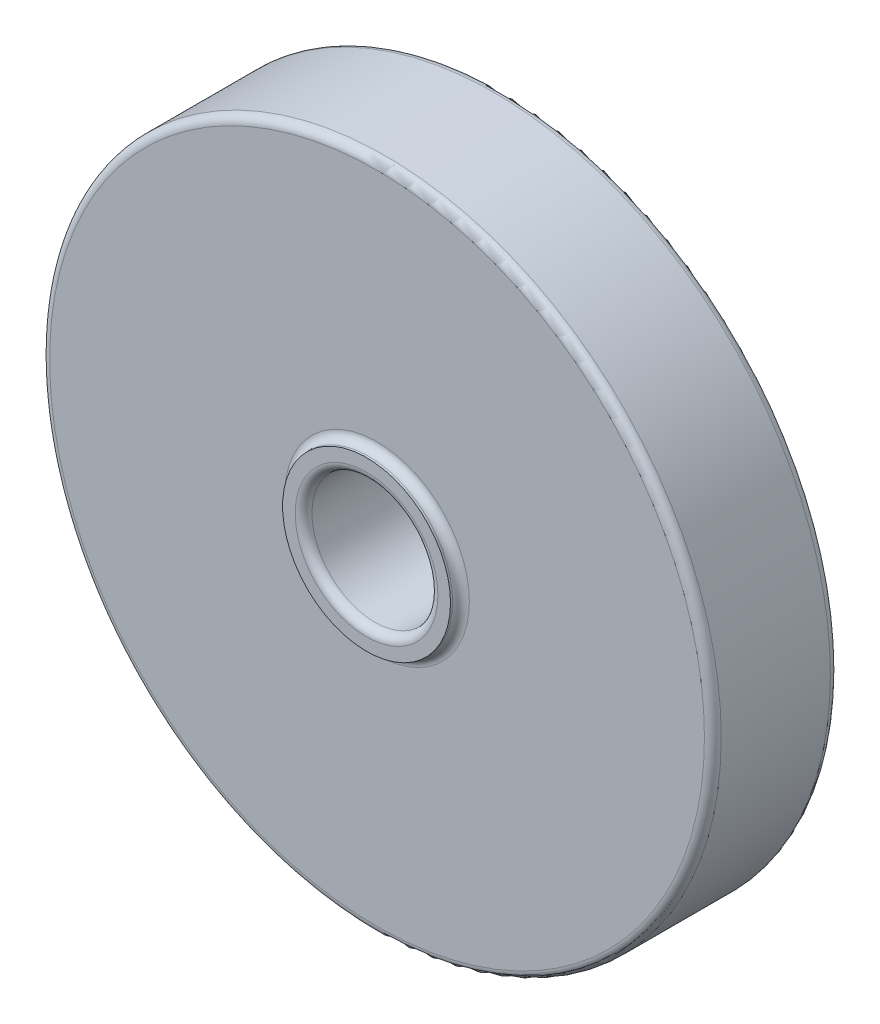
ISO-10303-21;
HEADER;
FILE_DESCRIPTION(('STEP AP214'),'2;1');
FILE_NAME('part.step','',(''),(''),'','','');
FILE_SCHEMA(('AUTOMOTIVE_DESIGN { 1 0 10303 214 1 1 1 1 }'));
ENDSEC;
DATA;
#1=APPLICATION_CONTEXT('core data for automotive mechanical design processes');
#2=APPLICATION_PROTOCOL_DEFINITION('international standard','automotive_design',2000,#1);
#3=PRODUCT_CONTEXT('',#1,'mechanical');
#4=PRODUCT('Part','Part','',(#3));
#5=PRODUCT_RELATED_PRODUCT_CATEGORY('part','',(#4));
#6=PRODUCT_DEFINITION_FORMATION('','',#4);
#7=PRODUCT_DEFINITION_CONTEXT('part definition',#1,'design');
#8=PRODUCT_DEFINITION('design','',#6,#7);
#9=PRODUCT_DEFINITION_SHAPE('','',#8);
#10=(LENGTH_UNIT() NAMED_UNIT(*) SI_UNIT(.MILLI.,.METRE.));
#11=(NAMED_UNIT(*) PLANE_ANGLE_UNIT() SI_UNIT($,.RADIAN.));
#12=(NAMED_UNIT(*) SI_UNIT($,.STERADIAN.) SOLID_ANGLE_UNIT());
#13=UNCERTAINTY_MEASURE_WITH_UNIT(LENGTH_MEASURE(1.E-05),#10,'distance_accuracy_value','');
#14=(GEOMETRIC_REPRESENTATION_CONTEXT(3) GLOBAL_UNCERTAINTY_ASSIGNED_CONTEXT((#13)) GLOBAL_UNIT_ASSIGNED_CONTEXT((#10,
#11,#12)) REPRESENTATION_CONTEXT('',''));
#15=CARTESIAN_POINT('',(0.,0.,0.));
#16=DIRECTION('',(0.,0.,1.));
#17=DIRECTION('',(1.,0.,0.));
#18=AXIS2_PLACEMENT_3D('',#15,#16,#17);
#19=CARTESIAN_POINT('',(0.,0.,3.));
#20=DIRECTION('',(0.,0.,1.));
#21=DIRECTION('',(1.,0.,0.));
#22=AXIS2_PLACEMENT_3D('',#19,#20,#21);
#23=PLANE('',#22);
#24=CARTESIAN_POINT('',(0.,0.,3.));
#25=DIRECTION('',(0.,0.,1.));
#26=DIRECTION('',(1.,0.,0.));
#27=AXIS2_PLACEMENT_3D('',#24,#25,#26);
#28=CIRCLE('',#27,2.2);
#29=CARTESIAN_POINT('',(2.2,0.,3.));
#30=VERTEX_POINT('',#29);
#31=EDGE_CURVE('E10',#30,#30,#28,.F.);
#32=ORIENTED_EDGE('',*,*,#31,.T.);
#33=EDGE_LOOP('',(#32));
#34=FACE_BOUND('',#33,.T.);
#35=CARTESIAN_POINT('',(0.,0.,3.));
#36=DIRECTION('',(0.,0.,1.));
#37=DIRECTION('',(1.,0.,0.));
#38=AXIS2_PLACEMENT_3D('',#35,#36,#37);
#39=CIRCLE('',#38,7.8);
#40=CARTESIAN_POINT('',(7.8,0.,3.));
#41=VERTEX_POINT('',#40);
#42=EDGE_CURVE('E38',#41,#41,#39,.T.);
#43=ORIENTED_EDGE('',*,*,#42,.T.);
#44=EDGE_LOOP('',(#43));
#45=FACE_BOUND('',#44,.T.);
#46=ADVANCED_FACE('F31',(#34,#45),#23,.T.);
#47=CARTESIAN_POINT('',(0.,0.,0.));
#48=DIRECTION('',(0.,0.,1.));
#49=DIRECTION('',(1.,0.,0.));
#50=AXIS2_PLACEMENT_3D('',#47,#48,#49);
#51=PLANE('',#50);
#52=CARTESIAN_POINT('',(0.,0.,0.));
#53=DIRECTION('',(0.,0.,1.));
#54=DIRECTION('',(1.,0.,0.));
#55=AXIS2_PLACEMENT_3D('',#52,#53,#54);
#56=CIRCLE('',#55,7.8);
#57=CARTESIAN_POINT('',(7.8,0.,0.));
#58=VERTEX_POINT('',#57);
#59=EDGE_CURVE('E57',#58,#58,#56,.F.);
#60=ORIENTED_EDGE('',*,*,#59,.T.);
#61=EDGE_LOOP('',(#60));
#62=FACE_BOUND('',#61,.T.);
#63=CARTESIAN_POINT('',(0.,0.,0.));
#64=DIRECTION('',(0.,0.,1.));
#65=DIRECTION('',(1.,0.,0.));
#66=AXIS2_PLACEMENT_3D('',#63,#64,#65);
#67=CIRCLE('',#66,1.7);
#68=CARTESIAN_POINT('',(1.7,0.,0.));
#69=VERTEX_POINT('',#68);
#70=EDGE_CURVE('E60',#69,#69,#67,.T.);
#71=ORIENTED_EDGE('',*,*,#70,.T.);
#72=EDGE_LOOP('',(#71));
#73=FACE_BOUND('',#72,.T.);
#74=ADVANCED_FACE('F92',(#62,#73),#51,.F.);
#75=CARTESIAN_POINT('',(0.,0.,3.));
#76=DIRECTION('',(0.,0.,-1.));
#77=DIRECTION('',(-1.,0.,0.));
#78=AXIS2_PLACEMENT_3D('',#75,#76,#77);
#79=CYLINDRICAL_SURFACE('',#78,8.);
#80=CARTESIAN_POINT('',(0.,0.,0.2));
#81=DIRECTION('',(0.,0.,1.));
#82=DIRECTION('',(1.,0.,0.));
#83=AXIS2_PLACEMENT_3D('',#80,#81,#82);
#84=CIRCLE('',#83,8.);
#85=CARTESIAN_POINT('',(8.,0.,0.2));
#86=VERTEX_POINT('',#85);
#87=EDGE_CURVE('E63',#86,#86,#84,.T.);
#88=ORIENTED_EDGE('',*,*,#87,.T.);
#89=EDGE_LOOP('',(#88));
#90=FACE_BOUND('',#89,.T.);
#91=CARTESIAN_POINT('',(0.,0.,2.8));
#92=DIRECTION('',(0.,0.,1.));
#93=DIRECTION('',(1.,0.,0.));
#94=AXIS2_PLACEMENT_3D('',#91,#92,#93);
#95=CIRCLE('',#94,8.);
#96=CARTESIAN_POINT('',(8.,0.,2.8));
#97=VERTEX_POINT('',#96);
#98=EDGE_CURVE('E66',#97,#97,#95,.F.);
#99=ORIENTED_EDGE('',*,*,#98,.T.);
#100=EDGE_LOOP('',(#99));
#101=FACE_BOUND('',#100,.T.);
#102=ADVANCED_FACE('F33',(#90,#101),#79,.T.);
#103=CARTESIAN_POINT('',(0.,0.,3.));
#104=DIRECTION('',(0.,0.,-1.));
#105=DIRECTION('',(-1.,0.,0.));
#106=AXIS2_PLACEMENT_3D('',#103,#104,#105);
#107=CYLINDRICAL_SURFACE('',#106,1.5);
#108=CARTESIAN_POINT('',(0.,0.,3.05));
#109=DIRECTION('',(0.,0.,1.));
#110=DIRECTION('',(1.,0.,0.));
#111=AXIS2_PLACEMENT_3D('',#108,#109,#110);
#112=CIRCLE('',#111,1.5);
#113=CARTESIAN_POINT('',(1.5,0.,3.05));
#114=VERTEX_POINT('',#113);
#115=EDGE_CURVE('E51',#114,#114,#112,.T.);
#116=ORIENTED_EDGE('',*,*,#115,.T.);
#117=EDGE_LOOP('',(#116));
#118=FACE_BOUND('',#117,.T.);
#119=CARTESIAN_POINT('',(0.,0.,0.2));
#120=DIRECTION('',(0.,0.,1.));
#121=DIRECTION('',(1.,0.,0.));
#122=AXIS2_PLACEMENT_3D('',#119,#120,#121);
#123=CIRCLE('',#122,1.5);
#124=CARTESIAN_POINT('',(1.5,0.,0.2));
#125=VERTEX_POINT('',#124);
#126=EDGE_CURVE('E54',#125,#125,#123,.F.);
#127=ORIENTED_EDGE('',*,*,#126,.T.);
#128=EDGE_LOOP('',(#127));
#129=FACE_BOUND('',#128,.T.);
#130=ADVANCED_FACE('F87',(#118,#129),#107,.F.);
#131=CARTESIAN_POINT('',(0.,0.,3.25));
#132=DIRECTION('',(0.,0.,1.));
#133=DIRECTION('',(1.,0.,0.));
#134=AXIS2_PLACEMENT_3D('',#131,#132,#133);
#135=PLANE('',#134);
#136=CARTESIAN_POINT('',(0.,0.,3.25));
#137=DIRECTION('',(0.,0.,1.));
#138=DIRECTION('',(1.,0.,0.));
#139=AXIS2_PLACEMENT_3D('',#136,#137,#138);
#140=CIRCLE('',#139,1.7);
#141=CARTESIAN_POINT('',(1.7,0.,3.25));
#142=VERTEX_POINT('',#141);
#143=EDGE_CURVE('E46',#142,#142,#140,.F.);
#144=ORIENTED_EDGE('',*,*,#143,.T.);
#145=EDGE_LOOP('',(#144));
#146=FACE_BOUND('',#145,.T.);
#147=CARTESIAN_POINT('',(0.,0.,3.25));
#148=DIRECTION('',(0.,0.,1.));
#149=DIRECTION('',(1.,0.,0.));
#150=AXIS2_PLACEMENT_3D('',#147,#148,#149);
#151=CIRCLE('',#150,2.);
#152=CARTESIAN_POINT('',(2.,0.,3.25));
#153=VERTEX_POINT('',#152);
#154=EDGE_CURVE('E69',#153,#153,#151,.T.);
#155=ORIENTED_EDGE('',*,*,#154,.T.);
#156=EDGE_LOOP('',(#155));
#157=FACE_BOUND('',#156,.T.);
#158=ADVANCED_FACE('F73',(#146,#157),#135,.T.);
#159=CARTESIAN_POINT('',(0.,0.,3.25));
#160=DIRECTION('',(0.,0.,-1.));
#161=DIRECTION('',(-1.,0.,0.));
#162=AXIS2_PLACEMENT_3D('',#159,#160,#161);
#163=CYLINDRICAL_SURFACE('',#162,2.);
#164=CARTESIAN_POINT('',(0.,0.,3.2));
#165=DIRECTION('',(0.,0.,1.));
#166=DIRECTION('',(1.,0.,0.));
#167=AXIS2_PLACEMENT_3D('',#164,#165,#166);
#168=CIRCLE('',#167,2.);
#169=CARTESIAN_POINT('',(2.,0.,3.2));
#170=VERTEX_POINT('',#169);
#171=EDGE_CURVE('E42',#170,#170,#168,.T.);
#172=ORIENTED_EDGE('',*,*,#171,.T.);
#173=EDGE_LOOP('',(#172));
#174=FACE_BOUND('',#173,.T.);
#175=ORIENTED_EDGE('',*,*,#154,.F.);
#176=EDGE_LOOP('',(#175));
#177=FACE_BOUND('',#176,.T.);
#178=ADVANCED_FACE('F75',(#174,#177),#163,.T.);
#179=CARTESIAN_POINT('',(0.,0.,0.2));
#180=DIRECTION('',(0.,0.,1.));
#181=DIRECTION('',(1.,0.,0.));
#182=AXIS2_PLACEMENT_3D('',#179,#180,#181);
#183=TOROIDAL_SURFACE('',#182,7.8,0.2);
#184=ORIENTED_EDGE('',*,*,#59,.F.);
#185=EDGE_LOOP('',(#184));
#186=FACE_BOUND('',#185,.T.);
#187=ORIENTED_EDGE('',*,*,#87,.F.);
#188=EDGE_LOOP('',(#187));
#189=FACE_BOUND('',#188,.T.);
#190=ADVANCED_FACE('F77',(#186,#189),#183,.T.);
#191=CARTESIAN_POINT('',(0.,0.,3.05));
#192=DIRECTION('',(0.,0.,1.));
#193=DIRECTION('',(1.,0.,0.));
#194=AXIS2_PLACEMENT_3D('',#191,#192,#193);
#195=TOROIDAL_SURFACE('',#194,1.7,0.2);
#196=ORIENTED_EDGE('',*,*,#143,.F.);
#197=EDGE_LOOP('',(#196));
#198=FACE_BOUND('',#197,.T.);
#199=ORIENTED_EDGE('',*,*,#115,.F.);
#200=EDGE_LOOP('',(#199));
#201=FACE_BOUND('',#200,.T.);
#202=ADVANCED_FACE('F84',(#198,#201),#195,.T.);
#203=CARTESIAN_POINT('',(0.,0.,0.2));
#204=DIRECTION('',(0.,0.,1.));
#205=DIRECTION('',(1.,0.,0.));
#206=AXIS2_PLACEMENT_3D('',#203,#204,#205);
#207=TOROIDAL_SURFACE('',#206,1.7,0.2);
#208=ORIENTED_EDGE('',*,*,#126,.F.);
#209=EDGE_LOOP('',(#208));
#210=FACE_BOUND('',#209,.T.);
#211=ORIENTED_EDGE('',*,*,#70,.F.);
#212=EDGE_LOOP('',(#211));
#213=FACE_BOUND('',#212,.T.);
#214=ADVANCED_FACE('F108',(#210,#213),#207,.T.);
#215=CARTESIAN_POINT('',(0.,0.,3.2));
#216=DIRECTION('',(0.,0.,1.));
#217=DIRECTION('',(1.,0.,0.));
#218=AXIS2_PLACEMENT_3D('',#215,#216,#217);
#219=TOROIDAL_SURFACE('',#218,2.2,0.2);
#220=ORIENTED_EDGE('',*,*,#31,.F.);
#221=EDGE_LOOP('',(#220));
#222=FACE_BOUND('',#221,.T.);
#223=ORIENTED_EDGE('',*,*,#171,.F.);
#224=EDGE_LOOP('',(#223));
#225=FACE_BOUND('',#224,.T.);
#226=ADVANCED_FACE('F111',(#222,#225),#219,.F.);
#227=CARTESIAN_POINT('',(0.,0.,2.8));
#228=DIRECTION('',(0.,0.,1.));
#229=DIRECTION('',(1.,0.,0.));
#230=AXIS2_PLACEMENT_3D('',#227,#228,#229);
#231=TOROIDAL_SURFACE('',#230,7.8,0.2);
#232=ORIENTED_EDGE('',*,*,#98,.F.);
#233=EDGE_LOOP('',(#232));
#234=FACE_BOUND('',#233,.T.);
#235=ORIENTED_EDGE('',*,*,#42,.F.);
#236=EDGE_LOOP('',(#235));
#237=FACE_BOUND('',#236,.T.);
#238=ADVANCED_FACE('F119',(#234,#237),#231,.T.);
#239=CLOSED_SHELL('',(#46,#74,#102,#130,#158,#178,#190,#202,#214,#226,#238));
#240=MANIFOLD_SOLID_BREP('B2',#239);
#241=ADVANCED_BREP_SHAPE_REPRESENTATION('',(#18,#240),#14);
#242=SHAPE_DEFINITION_REPRESENTATION(#9,#241);
ENDSEC;
END-ISO-10303-21;
